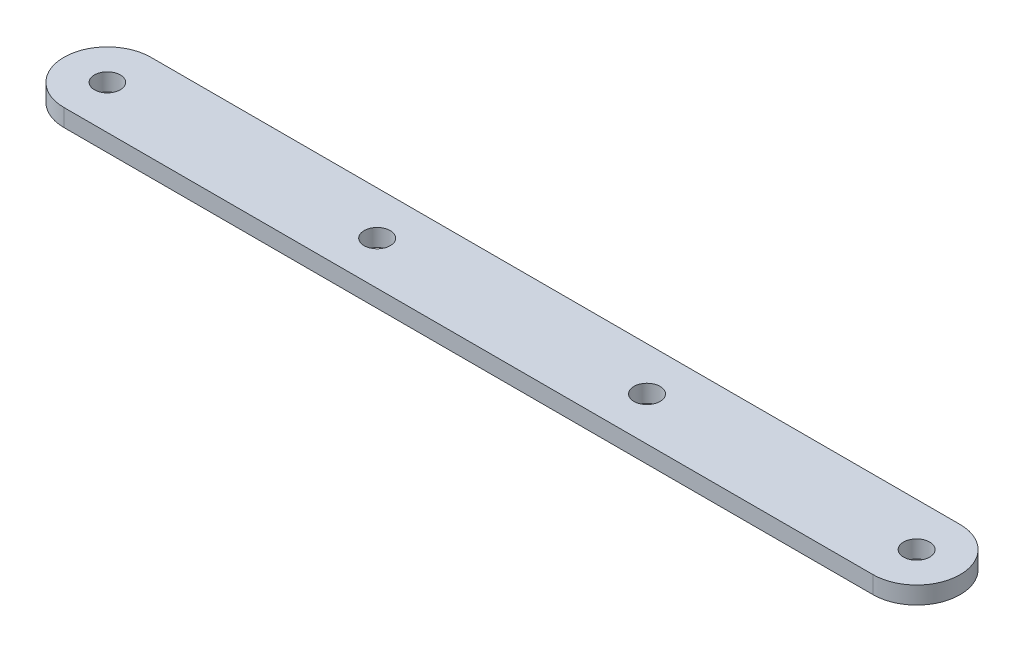
ISO-10303-21;
HEADER;
FILE_DESCRIPTION(('STEP AP214'),'2;1');
FILE_NAME('part.step','',(''),(''),'','','');
FILE_SCHEMA(('AUTOMOTIVE_DESIGN { 1 0 10303 214 1 1 1 1 }'));
ENDSEC;
DATA;
#1=APPLICATION_CONTEXT('core data for automotive mechanical design processes');
#2=APPLICATION_PROTOCOL_DEFINITION('international standard','automotive_design',2000,#1);
#3=PRODUCT_CONTEXT('',#1,'mechanical');
#4=PRODUCT('Part','Part','',(#3));
#5=PRODUCT_RELATED_PRODUCT_CATEGORY('part','',(#4));
#6=PRODUCT_DEFINITION_FORMATION('','',#4);
#7=PRODUCT_DEFINITION_CONTEXT('part definition',#1,'design');
#8=PRODUCT_DEFINITION('design','',#6,#7);
#9=PRODUCT_DEFINITION_SHAPE('','',#8);
#10=(LENGTH_UNIT() NAMED_UNIT(*) SI_UNIT(.MILLI.,.METRE.));
#11=(NAMED_UNIT(*) PLANE_ANGLE_UNIT() SI_UNIT($,.RADIAN.));
#12=(NAMED_UNIT(*) SI_UNIT($,.STERADIAN.) SOLID_ANGLE_UNIT());
#13=UNCERTAINTY_MEASURE_WITH_UNIT(LENGTH_MEASURE(1.E-05),#10,'distance_accuracy_value','');
#14=(GEOMETRIC_REPRESENTATION_CONTEXT(3) GLOBAL_UNCERTAINTY_ASSIGNED_CONTEXT((#13)) GLOBAL_UNIT_ASSIGNED_CONTEXT((#10,
#11,#12)) REPRESENTATION_CONTEXT('',''));
#15=CARTESIAN_POINT('',(0.,0.,0.));
#16=DIRECTION('',(0.,0.,1.));
#17=DIRECTION('',(1.,0.,0.));
#18=AXIS2_PLACEMENT_3D('',#15,#16,#17);
#19=CARTESIAN_POINT('',(-124.1,4.,0.));
#20=DIRECTION('',(0.,1.,0.));
#21=DIRECTION('',(0.,0.,1.));
#22=AXIS2_PLACEMENT_3D('',#19,#20,#21);
#23=PLANE('',#22);
#24=CARTESIAN_POINT('',(0.,4.,0.));
#25=DIRECTION('',(0.,1.,0.));
#26=DIRECTION('',(0.,0.,1.));
#27=AXIS2_PLACEMENT_3D('',#24,#25,#26);
#28=CIRCLE('',#27,3.01);
#29=CARTESIAN_POINT('',(0.,4.,3.01));
#30=VERTEX_POINT('',#29);
#31=EDGE_CURVE('E121',#30,#30,#28,.T.);
#32=ORIENTED_EDGE('',*,*,#31,.F.);
#33=EDGE_LOOP('',(#32));
#34=FACE_BOUND('',#33,.T.);
#35=CARTESIAN_POINT('',(-124.1,4.,0.));
#36=DIRECTION('',(0.,1.,0.));
#37=DIRECTION('',(0.,0.,1.));
#38=AXIS2_PLACEMENT_3D('',#35,#36,#37);
#39=CIRCLE('',#38,2.97500000000001);
#40=CARTESIAN_POINT('',(-124.1,4.,2.97500000000001));
#41=VERTEX_POINT('',#40);
#42=EDGE_CURVE('E100',#41,#41,#39,.T.);
#43=ORIENTED_EDGE('',*,*,#42,.F.);
#44=EDGE_LOOP('',(#43));
#45=FACE_BOUND('',#44,.T.);
#46=CARTESIAN_POINT('',(-124.1,4.,0.));
#47=DIRECTION('',(0.,1.,0.));
#48=DIRECTION('',(0.,0.,1.));
#49=AXIS2_PLACEMENT_3D('',#46,#47,#48);
#50=CIRCLE('',#49,10.);
#51=CARTESIAN_POINT('',(-124.1,4.,-10.));
#52=VERTEX_POINT('',#51);
#53=CARTESIAN_POINT('',(-124.1,4.,10.));
#54=VERTEX_POINT('',#53);
#55=EDGE_CURVE('E85',#52,#54,#50,.T.);
#56=ORIENTED_EDGE('',*,*,#55,.T.);
#57=DIRECTION('',(1.,0.,0.));
#58=VECTOR('',#57,1.);
#59=CARTESIAN_POINT('',(-124.1,4.,10.));
#60=LINE('',#59,#58);
#61=CARTESIAN_POINT('',(62.,4.,10.));
#62=VERTEX_POINT('',#61);
#63=EDGE_CURVE('E80',#54,#62,#60,.T.);
#64=ORIENTED_EDGE('',*,*,#63,.T.);
#65=CARTESIAN_POINT('',(62.,4.,0.));
#66=DIRECTION('',(0.,1.,0.));
#67=DIRECTION('',(0.,0.,1.));
#68=AXIS2_PLACEMENT_3D('',#65,#66,#67);
#69=CIRCLE('',#68,10.);
#70=CARTESIAN_POINT('',(62.,4.,-10.));
#71=VERTEX_POINT('',#70);
#72=EDGE_CURVE('E83',#62,#71,#69,.T.);
#73=ORIENTED_EDGE('',*,*,#72,.T.);
#74=DIRECTION('',(-1.,0.,0.));
#75=VECTOR('',#74,1.);
#76=CARTESIAN_POINT('',(-124.1,4.,-10.));
#77=LINE('',#76,#75);
#78=EDGE_CURVE('E50',#71,#52,#77,.T.);
#79=ORIENTED_EDGE('',*,*,#78,.T.);
#80=EDGE_LOOP('',(#56,#64,#73,#79));
#81=FACE_BOUND('',#80,.T.);
#82=CARTESIAN_POINT('',(-62.05,4.,0.));
#83=DIRECTION('',(0.,1.,0.));
#84=DIRECTION('',(0.,0.,1.));
#85=AXIS2_PLACEMENT_3D('',#82,#83,#84);
#86=CIRCLE('',#85,3.01);
#87=CARTESIAN_POINT('',(-62.05,4.,3.01));
#88=VERTEX_POINT('',#87);
#89=EDGE_CURVE('E115',#88,#88,#86,.T.);
#90=ORIENTED_EDGE('',*,*,#89,.F.);
#91=EDGE_LOOP('',(#90));
#92=FACE_BOUND('',#91,.T.);
#93=CARTESIAN_POINT('',(62.,4.,0.));
#94=DIRECTION('',(0.,1.,0.));
#95=DIRECTION('',(0.,0.,1.));
#96=AXIS2_PLACEMENT_3D('',#93,#94,#95);
#97=CIRCLE('',#96,3.01);
#98=CARTESIAN_POINT('',(62.,4.,3.01));
#99=VERTEX_POINT('',#98);
#100=EDGE_CURVE('E127',#99,#99,#97,.T.);
#101=ORIENTED_EDGE('',*,*,#100,.F.);
#102=EDGE_LOOP('',(#101));
#103=FACE_BOUND('',#102,.T.);
#104=ADVANCED_FACE('F33',(#34,#45,#81,#92,#103),#23,.T.);
#105=CARTESIAN_POINT('',(-124.1,0.,0.));
#106=DIRECTION('',(0.,1.,0.));
#107=DIRECTION('',(0.,0.,1.));
#108=AXIS2_PLACEMENT_3D('',#105,#106,#107);
#109=PLANE('',#108);
#110=CARTESIAN_POINT('',(-124.1,0.,0.));
#111=DIRECTION('',(0.,1.,0.));
#112=DIRECTION('',(0.,0.,1.));
#113=AXIS2_PLACEMENT_3D('',#110,#111,#112);
#114=CIRCLE('',#113,10.);
#115=CARTESIAN_POINT('',(-124.1,0.,-10.));
#116=VERTEX_POINT('',#115);
#117=CARTESIAN_POINT('',(-124.1,0.,10.));
#118=VERTEX_POINT('',#117);
#119=EDGE_CURVE('E97',#116,#118,#114,.T.);
#120=ORIENTED_EDGE('',*,*,#119,.F.);
#121=DIRECTION('',(-1.,0.,0.));
#122=VECTOR('',#121,1.);
#123=CARTESIAN_POINT('',(-124.1,0.,-10.));
#124=LINE('',#123,#122);
#125=CARTESIAN_POINT('',(62.,0.,-10.));
#126=VERTEX_POINT('',#125);
#127=EDGE_CURVE('E73',#126,#116,#124,.T.);
#128=ORIENTED_EDGE('',*,*,#127,.F.);
#129=CARTESIAN_POINT('',(62.,0.,0.));
#130=DIRECTION('',(0.,1.,0.));
#131=DIRECTION('',(0.,0.,1.));
#132=AXIS2_PLACEMENT_3D('',#129,#130,#131);
#133=CIRCLE('',#132,10.);
#134=CARTESIAN_POINT('',(62.,0.,10.));
#135=VERTEX_POINT('',#134);
#136=EDGE_CURVE('E67',#135,#126,#133,.T.);
#137=ORIENTED_EDGE('',*,*,#136,.F.);
#138=DIRECTION('',(1.,0.,0.));
#139=VECTOR('',#138,1.);
#140=CARTESIAN_POINT('',(-124.1,0.,10.));
#141=LINE('',#140,#139);
#142=EDGE_CURVE('E89',#118,#135,#141,.T.);
#143=ORIENTED_EDGE('',*,*,#142,.F.);
#144=EDGE_LOOP('',(#120,#128,#137,#143));
#145=FACE_BOUND('',#144,.T.);
#146=CARTESIAN_POINT('',(-124.1,0.,0.));
#147=DIRECTION('',(0.,1.,0.));
#148=DIRECTION('',(0.,0.,1.));
#149=AXIS2_PLACEMENT_3D('',#146,#147,#148);
#150=CIRCLE('',#149,2.97500000000001);
#151=CARTESIAN_POINT('',(-124.1,0.,2.97500000000001));
#152=VERTEX_POINT('',#151);
#153=EDGE_CURVE('E112',#152,#152,#150,.T.);
#154=ORIENTED_EDGE('',*,*,#153,.T.);
#155=EDGE_LOOP('',(#154));
#156=FACE_BOUND('',#155,.T.);
#157=CARTESIAN_POINT('',(-62.05,0.,0.));
#158=DIRECTION('',(0.,1.,0.));
#159=DIRECTION('',(0.,0.,1.));
#160=AXIS2_PLACEMENT_3D('',#157,#158,#159);
#161=CIRCLE('',#160,3.01);
#162=CARTESIAN_POINT('',(-62.05,0.,3.01));
#163=VERTEX_POINT('',#162);
#164=EDGE_CURVE('E118',#163,#163,#161,.T.);
#165=ORIENTED_EDGE('',*,*,#164,.T.);
#166=EDGE_LOOP('',(#165));
#167=FACE_BOUND('',#166,.T.);
#168=CARTESIAN_POINT('',(0.,0.,0.));
#169=DIRECTION('',(0.,1.,0.));
#170=DIRECTION('',(0.,0.,1.));
#171=AXIS2_PLACEMENT_3D('',#168,#169,#170);
#172=CIRCLE('',#171,3.01);
#173=CARTESIAN_POINT('',(0.,0.,3.01));
#174=VERTEX_POINT('',#173);
#175=EDGE_CURVE('E124',#174,#174,#172,.T.);
#176=ORIENTED_EDGE('',*,*,#175,.T.);
#177=EDGE_LOOP('',(#176));
#178=FACE_BOUND('',#177,.T.);
#179=CARTESIAN_POINT('',(62.,0.,0.));
#180=DIRECTION('',(0.,1.,0.));
#181=DIRECTION('',(0.,0.,1.));
#182=AXIS2_PLACEMENT_3D('',#179,#180,#181);
#183=CIRCLE('',#182,3.01);
#184=CARTESIAN_POINT('',(62.,0.,3.01));
#185=VERTEX_POINT('',#184);
#186=EDGE_CURVE('E130',#185,#185,#183,.T.);
#187=ORIENTED_EDGE('',*,*,#186,.T.);
#188=EDGE_LOOP('',(#187));
#189=FACE_BOUND('',#188,.T.);
#190=ADVANCED_FACE('F108',(#145,#156,#167,#178,#189),#109,.F.);
#191=CARTESIAN_POINT('',(-124.1,4.,0.));
#192=DIRECTION('',(0.,-1.,0.));
#193=DIRECTION('',(0.,0.,-1.));
#194=AXIS2_PLACEMENT_3D('',#191,#192,#193);
#195=CYLINDRICAL_SURFACE('',#194,10.);
#196=ORIENTED_EDGE('',*,*,#119,.T.);
#197=DIRECTION('',(0.,-1.,0.));
#198=VECTOR('',#197,1.);
#199=CARTESIAN_POINT('',(-124.1,4.,10.));
#200=LINE('',#199,#198);
#201=EDGE_CURVE('E11',#54,#118,#200,.T.);
#202=ORIENTED_EDGE('',*,*,#201,.F.);
#203=ORIENTED_EDGE('',*,*,#55,.F.);
#204=DIRECTION('',(0.,-1.,0.));
#205=VECTOR('',#204,1.);
#206=CARTESIAN_POINT('',(-124.1,4.,-10.));
#207=LINE('',#206,#205);
#208=EDGE_CURVE('E93',#52,#116,#207,.T.);
#209=ORIENTED_EDGE('',*,*,#208,.T.);
#210=EDGE_LOOP('',(#196,#202,#203,#209));
#211=FACE_BOUND('',#210,.T.);
#212=ADVANCED_FACE('F35',(#211),#195,.T.);
#213=CARTESIAN_POINT('',(-124.1,4.,10.));
#214=DIRECTION('',(0.,0.,-1.));
#215=DIRECTION('',(-1.,0.,0.));
#216=AXIS2_PLACEMENT_3D('',#213,#214,#215);
#217=PLANE('',#216);
#218=ORIENTED_EDGE('',*,*,#142,.T.);
#219=DIRECTION('',(0.,-1.,0.));
#220=VECTOR('',#219,1.);
#221=CARTESIAN_POINT('',(62.,4.,10.));
#222=LINE('',#221,#220);
#223=EDGE_CURVE('E42',#62,#135,#222,.T.);
#224=ORIENTED_EDGE('',*,*,#223,.F.);
#225=ORIENTED_EDGE('',*,*,#63,.F.);
#226=ORIENTED_EDGE('',*,*,#201,.T.);
#227=EDGE_LOOP('',(#218,#224,#225,#226));
#228=FACE_BOUND('',#227,.T.);
#229=ADVANCED_FACE('F88',(#228),#217,.F.);
#230=CARTESIAN_POINT('',(62.,4.,0.));
#231=DIRECTION('',(0.,-1.,0.));
#232=DIRECTION('',(0.,0.,-1.));
#233=AXIS2_PLACEMENT_3D('',#230,#231,#232);
#234=CYLINDRICAL_SURFACE('',#233,10.);
#235=ORIENTED_EDGE('',*,*,#136,.T.);
#236=DIRECTION('',(0.,-1.,0.));
#237=VECTOR('',#236,1.);
#238=CARTESIAN_POINT('',(62.,4.,-10.));
#239=LINE('',#238,#237);
#240=EDGE_CURVE('E90',#71,#126,#239,.T.);
#241=ORIENTED_EDGE('',*,*,#240,.F.);
#242=ORIENTED_EDGE('',*,*,#72,.F.);
#243=ORIENTED_EDGE('',*,*,#223,.T.);
#244=EDGE_LOOP('',(#235,#241,#242,#243));
#245=FACE_BOUND('',#244,.T.);
#246=ADVANCED_FACE('F91',(#245),#234,.T.);
#247=CARTESIAN_POINT('',(-124.1,4.,-10.));
#248=DIRECTION('',(0.,0.,1.));
#249=DIRECTION('',(1.,0.,0.));
#250=AXIS2_PLACEMENT_3D('',#247,#248,#249);
#251=PLANE('',#250);
#252=ORIENTED_EDGE('',*,*,#127,.T.);
#253=ORIENTED_EDGE('',*,*,#208,.F.);
#254=ORIENTED_EDGE('',*,*,#78,.F.);
#255=ORIENTED_EDGE('',*,*,#240,.T.);
#256=EDGE_LOOP('',(#252,#253,#254,#255));
#257=FACE_BOUND('',#256,.T.);
#258=ADVANCED_FACE('F105',(#257),#251,.F.);
#259=CARTESIAN_POINT('',(-124.1,4.,0.));
#260=DIRECTION('',(0.,-1.,0.));
#261=DIRECTION('',(0.,0.,-1.));
#262=AXIS2_PLACEMENT_3D('',#259,#260,#261);
#263=CYLINDRICAL_SURFACE('',#262,2.97500000000001);
#264=ORIENTED_EDGE('',*,*,#42,.T.);
#265=EDGE_LOOP('',(#264));
#266=FACE_BOUND('',#265,.T.);
#267=ORIENTED_EDGE('',*,*,#153,.F.);
#268=EDGE_LOOP('',(#267));
#269=FACE_BOUND('',#268,.T.);
#270=ADVANCED_FACE('F149',(#266,#269),#263,.F.);
#271=CARTESIAN_POINT('',(-62.05,4.,0.));
#272=DIRECTION('',(0.,-1.,0.));
#273=DIRECTION('',(0.,0.,-1.));
#274=AXIS2_PLACEMENT_3D('',#271,#272,#273);
#275=CYLINDRICAL_SURFACE('',#274,3.01);
#276=ORIENTED_EDGE('',*,*,#89,.T.);
#277=EDGE_LOOP('',(#276));
#278=FACE_BOUND('',#277,.T.);
#279=ORIENTED_EDGE('',*,*,#164,.F.);
#280=EDGE_LOOP('',(#279));
#281=FACE_BOUND('',#280,.T.);
#282=ADVANCED_FACE('F195',(#278,#281),#275,.F.);
#283=CARTESIAN_POINT('',(0.,4.,0.));
#284=DIRECTION('',(0.,-1.,0.));
#285=DIRECTION('',(0.,0.,-1.));
#286=AXIS2_PLACEMENT_3D('',#283,#284,#285);
#287=CYLINDRICAL_SURFACE('',#286,3.01);
#288=ORIENTED_EDGE('',*,*,#31,.T.);
#289=EDGE_LOOP('',(#288));
#290=FACE_BOUND('',#289,.T.);
#291=ORIENTED_EDGE('',*,*,#175,.F.);
#292=EDGE_LOOP('',(#291));
#293=FACE_BOUND('',#292,.T.);
#294=ADVANCED_FACE('F203',(#290,#293),#287,.F.);
#295=CARTESIAN_POINT('',(62.,4.,0.));
#296=DIRECTION('',(0.,-1.,0.));
#297=DIRECTION('',(0.,0.,-1.));
#298=AXIS2_PLACEMENT_3D('',#295,#296,#297);
#299=CYLINDRICAL_SURFACE('',#298,3.01);
#300=ORIENTED_EDGE('',*,*,#100,.T.);
#301=EDGE_LOOP('',(#300));
#302=FACE_BOUND('',#301,.T.);
#303=ORIENTED_EDGE('',*,*,#186,.F.);
#304=EDGE_LOOP('',(#303));
#305=FACE_BOUND('',#304,.T.);
#306=ADVANCED_FACE('F136',(#302,#305),#299,.F.);
#307=CLOSED_SHELL('',(#104,#190,#212,#229,#246,#258,#270,#282,#294,#306));
#308=MANIFOLD_SOLID_BREP('B2',#307);
#309=ADVANCED_BREP_SHAPE_REPRESENTATION('',(#18,#308),#14);
#310=SHAPE_DEFINITION_REPRESENTATION(#9,#309);
ENDSEC;
END-ISO-10303-21;
